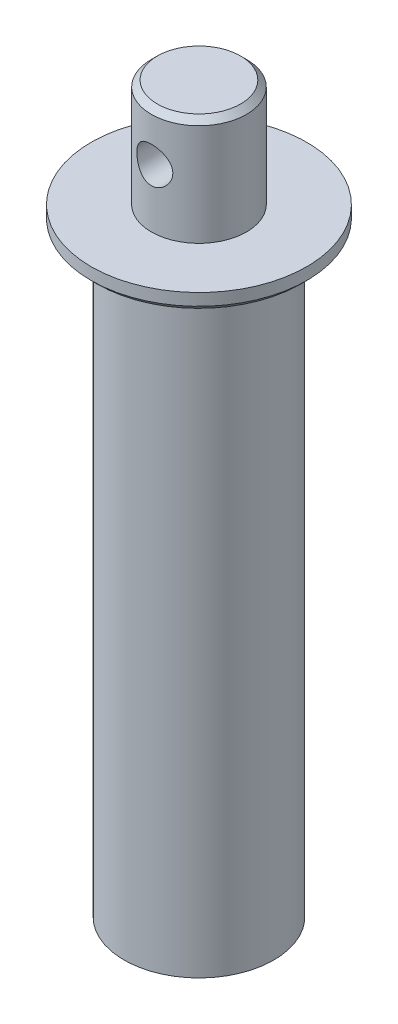
ISO-10303-21;
HEADER;
FILE_DESCRIPTION(('STEP AP214'),'2;1');
FILE_NAME('part.step','',(''),(''),'','','');
FILE_SCHEMA(('AUTOMOTIVE_DESIGN { 1 0 10303 214 1 1 1 1 }'));
ENDSEC;
DATA;
#1=APPLICATION_CONTEXT('core data for automotive mechanical design processes');
#2=APPLICATION_PROTOCOL_DEFINITION('international standard','automotive_design',2000,#1);
#3=PRODUCT_CONTEXT('',#1,'mechanical');
#4=PRODUCT('Part','Part','',(#3));
#5=PRODUCT_RELATED_PRODUCT_CATEGORY('part','',(#4));
#6=PRODUCT_DEFINITION_FORMATION('','',#4);
#7=PRODUCT_DEFINITION_CONTEXT('part definition',#1,'design');
#8=PRODUCT_DEFINITION('design','',#6,#7);
#9=PRODUCT_DEFINITION_SHAPE('','',#8);
#10=(LENGTH_UNIT() NAMED_UNIT(*) SI_UNIT(.MILLI.,.METRE.));
#11=(NAMED_UNIT(*) PLANE_ANGLE_UNIT() SI_UNIT($,.RADIAN.));
#12=(NAMED_UNIT(*) SI_UNIT($,.STERADIAN.) SOLID_ANGLE_UNIT());
#13=UNCERTAINTY_MEASURE_WITH_UNIT(LENGTH_MEASURE(1.E-05),#10,'distance_accuracy_value','');
#14=(GEOMETRIC_REPRESENTATION_CONTEXT(3) GLOBAL_UNCERTAINTY_ASSIGNED_CONTEXT((#13)) GLOBAL_UNIT_ASSIGNED_CONTEXT((#10,
#11,#12)) REPRESENTATION_CONTEXT('',''));
#15=CARTESIAN_POINT('',(0.,0.,0.));
#16=DIRECTION('',(0.,0.,1.));
#17=DIRECTION('',(1.,0.,0.));
#18=AXIS2_PLACEMENT_3D('',#15,#16,#17);
#19=CARTESIAN_POINT('',(0.,18.,0.));
#20=DIRECTION('',(0.,-1.,0.));
#21=DIRECTION('',(0.,0.,-1.));
#22=AXIS2_PLACEMENT_3D('',#19,#20,#21);
#23=CYLINDRICAL_SURFACE('',#22,7.95);
#24=CARTESIAN_POINT('',(0.,12.7,-7.95));
#25=CARTESIAN_POINT('',(-0.162397491346748,12.7000061558222,-7.95000463305476));
#26=CARTESIAN_POINT('',(-0.324753099848184,12.686772434708,-7.94498084128038));
#27=CARTESIAN_POINT('',(-0.644608276496746,12.6344046885734,-7.92544254710234));
#28=CARTESIAN_POINT('',(-0.802108607238702,12.5952747528614,-7.91092954315817));
#29=CARTESIAN_POINT('',(-1.10759384707584,12.4926982224202,-7.87396945860854));
#30=CARTESIAN_POINT('',(-1.25559660387506,12.4292988958457,-7.85153780728387));
#31=CARTESIAN_POINT('',(-1.53885384506537,12.2802252539554,-7.80097147100144));
#32=CARTESIAN_POINT('',(-1.67410485143574,12.1945448853293,-7.77283523668182));
#33=CARTESIAN_POINT('',(-1.93382546780257,11.9995011008524,-7.71241146666441));
#34=CARTESIAN_POINT('',(-2.05767538384719,11.8893495621118,-7.68000542519286));
#35=CARTESIAN_POINT('',(-2.28564512635348,11.6501633262448,-7.61527381268037));
#36=CARTESIAN_POINT('',(-2.38975880250598,11.5211227649516,-7.58294826981162));
#37=CARTESIAN_POINT('',(-2.57926636225751,11.2417374560993,-7.52065411531348));
#38=CARTESIAN_POINT('',(-2.6637805831916,11.0907618050901,-7.49082499932832));
#39=CARTESIAN_POINT('',(-2.80594178602416,10.7754371382371,-7.43874757327125));
#40=CARTESIAN_POINT('',(-2.86359965340992,10.611093572494,-7.41649619275682));
#41=CARTESIAN_POINT('',(-2.94795796885627,10.2808348690774,-7.38336190811873));
#42=CARTESIAN_POINT('',(-2.97584212262488,10.115266990026,-7.37204616258461));
#43=CARTESIAN_POINT('',(-3.00356228598173,9.7814451398545,-7.36079887492185));
#44=CARTESIAN_POINT('',(-3.00341006762254,9.61319232577162,-7.36086255474267));
#45=CARTESIAN_POINT('',(-2.97596618835097,9.28965599589298,-7.37199408836324));
#46=CARTESIAN_POINT('',(-2.950323119074,9.13420535263497,-7.38239348387374));
#47=CARTESIAN_POINT('',(-2.87535300460385,8.83000298266155,-7.41191277552078));
#48=CARTESIAN_POINT('',(-2.8260223465669,8.68125228161165,-7.43103400189338));
#49=CARTESIAN_POINT('',(-2.70418189216197,8.39133492929746,-7.47624078591974));
#50=CARTESIAN_POINT('',(-2.6312480533409,8.2503669739539,-7.50245218680417));
#51=CARTESIAN_POINT('',(-2.46456734066459,7.98219471048518,-7.55884475137268));
#52=CARTESIAN_POINT('',(-2.3708132173386,7.8549952194409,-7.58902729628462));
#53=CARTESIAN_POINT('',(-2.15763402761747,7.60885443691731,-7.65246921492573));
#54=CARTESIAN_POINT('',(-2.03689525756286,7.49106604037545,-7.68579812115875));
#55=CARTESIAN_POINT('',(-1.77699753283556,7.27706373431274,-7.75001160096118));
#56=CARTESIAN_POINT('',(-1.63783568074396,7.18085322479597,-7.78089578882361));
#57=CARTESIAN_POINT('',(-1.34207116187379,7.01144460931163,-7.8373678710877));
#58=CARTESIAN_POINT('',(-1.18522721144044,6.93863503487575,-7.86286415320891));
#59=CARTESIAN_POINT('',(-0.86031470200094,6.82081904211372,-7.90500692503182));
#60=CARTESIAN_POINT('',(-0.692251231753698,6.77580011265377,-7.92165739657785));
#61=CARTESIAN_POINT('',(-0.359369733398546,6.71707032438193,-7.94353018166807));
#62=CARTESIAN_POINT('',(-0.19486250407749,6.70180726332692,-7.94931845634064));
#63=CARTESIAN_POINT('',(0.134445660228267,6.69849692676496,-7.95056675753456));
#64=CARTESIAN_POINT('',(0.299246520773491,6.71044352644258,-7.94602910839152));
#65=CARTESIAN_POINT('',(0.617726140759181,6.76003703811891,-7.92750856979343));
#66=CARTESIAN_POINT('',(0.771587980773982,6.79666317138276,-7.91390105530444));
#67=CARTESIAN_POINT('',(1.07087124221814,6.89322789669408,-7.87898797802321));
#68=CARTESIAN_POINT('',(1.21629156356081,6.95316951937971,-7.85768141450416));
#69=CARTESIAN_POINT('',(1.49937620417867,7.09658093164373,-7.8086891601555));
#70=CARTESIAN_POINT('',(1.63668485220481,7.18069302598826,-7.78083372768987));
#71=CARTESIAN_POINT('',(1.89570132393103,7.36933296202654,-7.7218192041405));
#72=CARTESIAN_POINT('',(2.01740330922294,7.47386840734707,-7.6906588846264));
#73=CARTESIAN_POINT('',(2.24923419609776,7.70761385915857,-7.62618977395529));
#74=CARTESIAN_POINT('',(2.35826281750802,7.83791282891418,-7.59286232939511));
#75=CARTESIAN_POINT('',(2.55312943709526,8.1156069199928,-7.52957881379437));
#76=CARTESIAN_POINT('',(2.63896520992051,8.26300367990923,-7.49962306642862));
#77=CARTESIAN_POINT('',(2.78513438407435,8.57201209893149,-7.44658528316189));
#78=CARTESIAN_POINT('',(2.84534845350868,8.733686127761,-7.42353555585956));
#79=CARTESIAN_POINT('',(2.93729581964043,9.06599351023611,-7.38764350420071));
#80=CARTESIAN_POINT('',(2.96904704082561,9.23662115356447,-7.374794756358));
#81=CARTESIAN_POINT('',(3.00155503802499,9.57005302179686,-7.36161978142478));
#82=CARTESIAN_POINT('',(3.00419110375903,9.73264550820018,-7.36053436127972));
#83=CARTESIAN_POINT('',(2.98321973734044,10.0558276842463,-7.36905868877781));
#84=CARTESIAN_POINT('',(2.95961485946022,10.2164175672823,-7.37866739546335));
#85=CARTESIAN_POINT('',(2.88830176573362,10.5259293606051,-7.40686184253781));
#86=CARTESIAN_POINT('',(2.84137107510192,10.6750591479437,-7.42515720122094));
#87=CARTESIAN_POINT('',(2.72542723369112,10.963412785519,-7.46849099490141));
#88=CARTESIAN_POINT('',(2.65640846747208,11.1026341057172,-7.49353114436682));
#89=CARTESIAN_POINT('',(2.4940127469099,11.375226883347,-7.54918066261999));
#90=CARTESIAN_POINT('',(2.39954048534419,11.5078994030905,-7.58001455370614));
#91=CARTESIAN_POINT('',(2.19060617827199,11.7561080525092,-7.64301253026733));
#92=CARTESIAN_POINT('',(2.07613773887328,11.8716386790474,-7.67517703869663));
#93=CARTESIAN_POINT('',(1.82292686694646,12.0887750295145,-7.73934015838431));
#94=CARTESIAN_POINT('',(1.68319475235042,12.1892633965218,-7.7712320684291));
#95=CARTESIAN_POINT('',(1.38770505428977,12.365304905216,-7.82939530273651));
#96=CARTESIAN_POINT('',(1.23194587961074,12.4408555678737,-7.85566606811619));
#97=CARTESIAN_POINT('',(0.900729443719499,12.5673316594021,-7.90065816243918));
#98=CARTESIAN_POINT('',(0.72468257870646,12.6168806341044,-7.91895015266806));
#99=CARTESIAN_POINT('',(0.36573704474032,12.6832028472176,-7.94361537532247));
#100=CARTESIAN_POINT('',(0.182841976353428,12.6999930692113,-7.94999478368242));
#101=CARTESIAN_POINT('',(0.,12.7,-7.95));
#102=B_SPLINE_CURVE_WITH_KNOTS('',3,(#24,#25,#26,#27,#28,#29,#30,#31,#32,#33,#34,#35,#36,#37,
#38,#39,#40,#41,#42,#43,#44,#45,#46,#47,#48,#49,#50,#51,#52,#53,#54,#55,#56,#57,#58,#59,#60,#61,
#62,#63,#64,#65,#66,#67,#68,#69,#70,#71,#72,#73,#74,#75,#76,#77,#78,#79,#80,#81,#82,#83,#84,#85,
#86,#87,#88,#89,#90,#91,#92,#93,#94,#95,#96,#97,#98,#99,#100,#101),.UNSPECIFIED.,.T.,.F.,(4,2,2,
2,2,2,2,2,2,2,2,2,2,2,2,2,2,2,2,2,2,2,2,2,2,2,2,2,2,2,2,2,2,2,2,2,2,2,4),(0.,0.486517984474757,
0.972959160520783,1.45845770295972,1.94408828362444,2.44851024997547,2.95308914942897,
3.47718162143792,4.00106148167018,4.50323487057201,5.00519740487303,5.47667849204093,
5.94823151260985,6.42877607760176,6.90948822777715,7.42294833461538,7.93648929004924,
8.45816227693261,8.97960023906363,9.4730216283662,9.96633196092749,10.4403977118492,
10.9145251042877,11.4026484582173,11.8909538882842,12.4079529144854,12.9250015290952,
13.4444325927827,13.9635363143255,14.4489214843418,14.9342594114916,15.4044069203738,
15.8746740496895,16.36981560475,16.8651157749309,17.3876947690209,17.9103256964684,
18.4583764326353,19.0061429595389),.UNSPECIFIED.);
#103=CARTESIAN_POINT('',(0.,12.7,-7.95));
#104=VERTEX_POINT('',#103);
#105=EDGE_CURVE('E38',#104,#104,#102,.T.);
#106=ORIENTED_EDGE('',*,*,#105,.T.);
#107=EDGE_LOOP('',(#106));
#108=FACE_BOUND('',#107,.T.);
#109=CARTESIAN_POINT('',(3.,9.7,7.36223471508482));
#110=CARTESIAN_POINT('',(2.99998847638603,9.53818087912798,7.36224526269351));
#111=CARTESIAN_POINT('',(2.9868408533845,9.3762103722872,7.36763957602915));
#112=CARTESIAN_POINT('',(2.93479898105657,9.05725888996367,7.38851783959744));
#113=CARTESIAN_POINT('',(2.89590575612689,8.90027771621983,7.40400138838714));
#114=CARTESIAN_POINT('',(2.79402781177854,8.59586930724842,7.44304061076884));
#115=CARTESIAN_POINT('',(2.731101471071,8.44841992534473,7.46657670963436));
#116=CARTESIAN_POINT('',(2.58314510981222,8.16612081406447,7.51904250584225));
#117=CARTESIAN_POINT('',(2.49810836153358,8.03127493667398,7.54797384408236));
#118=CARTESIAN_POINT('',(2.30376153242717,7.77121232087998,7.60960064181843));
#119=CARTESIAN_POINT('',(2.19351841745457,7.64671904452181,7.64240778971228));
#120=CARTESIAN_POINT('',(1.95386685111475,7.41747705800545,7.70715883050975));
#121=CARTESIAN_POINT('',(1.82445425584252,7.31273262815022,7.73910253499114));
#122=CARTESIAN_POINT('',(1.5446329927432,7.12246295020474,7.79985728918744));
#123=CARTESIAN_POINT('',(1.3936537720354,7.03772592201908,7.82852214322748));
#124=CARTESIAN_POINT('',(1.07830992462711,6.89515458942065,7.87814508841391));
#125=CARTESIAN_POINT('',(0.913950027301735,6.83731082772747,7.89910588822244));
#126=CARTESIAN_POINT('',(0.584118525776006,6.75271083408455,7.93016590252776));
#127=CARTESIAN_POINT('',(0.419008191449069,6.72470854121812,7.9406990457691));
#128=CARTESIAN_POINT('',(0.0861182550130894,6.69659199426228,7.9512752587645));
#129=CARTESIAN_POINT('',(-0.0816604499755095,6.69646855740847,7.95132178261133));
#130=CARTESIAN_POINT('',(-0.406186165059413,6.7233915100908,7.94119442034515));
#131=CARTESIAN_POINT('',(-0.563064807507878,6.74907733331319,7.93153233504782));
#132=CARTESIAN_POINT('',(-0.870095460195534,6.82459864135385,7.90374636952053));
#133=CARTESIAN_POINT('',(-1.02024699260719,6.87443583868587,7.88562188924655));
#134=CARTESIAN_POINT('',(-1.31216781002694,6.9974680388243,7.84237373573117));
#135=CARTESIAN_POINT('',(-1.45378254871369,7.07099371538483,7.81715165701678));
#136=CARTESIAN_POINT('',(-1.72301698371786,7.23902153583117,7.76225605799518));
#137=CARTESIAN_POINT('',(-1.85063211474019,7.33353049219717,7.73258109302015));
#138=CARTESIAN_POINT('',(-2.09625291168491,7.54737826155229,7.66976135047149));
#139=CARTESIAN_POINT('',(-2.2132430127343,7.66785547278632,7.63651515908535));
#140=CARTESIAN_POINT('',(-2.42574456827632,7.92691204717986,7.57169953695764));
#141=CARTESIAN_POINT('',(-2.52125048739725,8.06549606102768,7.54013053993966));
#142=CARTESIAN_POINT('',(-2.69004722792075,8.36088829744311,7.48159976832992));
#143=CARTESIAN_POINT('',(-2.76278393320141,8.51803907720284,7.45475898596922));
#144=CARTESIAN_POINT('',(-2.880375100483,8.84363902404656,7.41012433225883));
#145=CARTESIAN_POINT('',(-2.92524531348823,9.0120817488069,7.39232535124068));
#146=CARTESIAN_POINT('',(-2.98350497294114,9.34543862821912,7.36899818161272));
#147=CARTESIAN_POINT('',(-2.99850974291805,9.51002612552786,7.36284132147711));
#148=CARTESIAN_POINT('',(-3.00127750176349,9.83944639008965,7.36171480133552));
#149=CARTESIAN_POINT('',(-2.98904742268387,10.0042790842612,7.36674229458981));
#150=CARTESIAN_POINT('',(-2.93915784101862,10.3211629550074,7.38677890427645));
#151=CARTESIAN_POINT('',(-2.90275536170076,10.4734469127311,7.40129408111521));
#152=CARTESIAN_POINT('',(-2.80714040331809,10.7696728223296,7.43808226609779));
#153=CARTESIAN_POINT('',(-2.74792321527995,10.9136130449902,7.46035687570344));
#154=CARTESIAN_POINT('',(-2.60584361626127,11.1951164240263,7.51118902933162));
#155=CARTESIAN_POINT('',(-2.5221722334124,11.3322330449096,7.53995219207521));
#156=CARTESIAN_POINT('',(-2.33441687648243,11.5910526702668,7.60017799915619));
#157=CARTESIAN_POINT('',(-2.2303253503514,11.7127499446626,7.63164163979143));
#158=CARTESIAN_POINT('',(-1.99676156560833,11.9453999274485,7.69616935064396));
#159=CARTESIAN_POINT('',(-1.86608723424952,12.055157597863,7.72920614910852));
#160=CARTESIAN_POINT('',(-1.5873664361605,12.2513337907439,7.79122096312534));
#161=CARTESIAN_POINT('',(-1.43931986006059,12.3377521662627,7.82019895312222));
#162=CARTESIAN_POINT('',(-1.13009967886562,12.4842477994431,7.87082025135715));
#163=CARTESIAN_POINT('',(-0.968969651016516,12.5444085640794,7.89248676165433));
#164=CARTESIAN_POINT('',(-0.637870931627841,12.6364273074365,7.9261118932038));
#165=CARTESIAN_POINT('',(-0.467906493780563,12.6682987760011,7.9380751412537));
#166=CARTESIAN_POINT('',(-0.134758318572021,12.7013659427001,7.95050234819133));
#167=CARTESIAN_POINT('',(0.0282347182748412,12.7042587720064,7.95160244842512));
#168=CARTESIAN_POINT('',(0.352286714056232,12.6836626905325,7.94384354853882));
#169=CARTESIAN_POINT('',(0.513345908784079,12.6601770297837,7.93498577530464));
#170=CARTESIAN_POINT('',(0.824872903926982,12.5886848977638,7.90859918182994));
#171=CARTESIAN_POINT('',(0.975504704927181,12.5413048913794,7.89129223621013));
#172=CARTESIAN_POINT('',(1.26668938334082,12.4239952510697,7.84981845145297));
#173=CARTESIAN_POINT('',(1.407240345928,12.3540613468895,7.82565031335174));
#174=CARTESIAN_POINT('',(1.68078304743255,12.1902710199168,7.77159770902848));
#175=CARTESIAN_POINT('',(1.81320405662409,12.0955282806332,7.74151478259925));
#176=CARTESIAN_POINT('',(2.06079145832988,11.886191784806,7.67932043381079));
#177=CARTESIAN_POINT('',(2.17595163342778,11.7715909071818,7.64720828641126));
#178=CARTESIAN_POINT('',(2.39209703979936,11.5185257698201,7.58246561904029));
#179=CARTESIAN_POINT('',(2.49199147751535,11.3791116040763,7.54989958951667));
#180=CARTESIAN_POINT('',(2.66701047282742,11.0843339824656,7.48987098387787));
#181=CARTESIAN_POINT('',(2.74213185351583,10.9289684843405,7.46240906251267));
#182=CARTESIAN_POINT('',(2.83572851156726,10.6832960070156,7.427133469645));
#183=CARTESIAN_POINT('',(2.86416654860317,10.5971118170317,7.41618073356408));
#184=CARTESIAN_POINT('',(2.91317517775546,10.4222468796589,7.39706747795765));
#185=CARTESIAN_POINT('',(2.93374932570495,10.3335672801464,7.38890569661591));
#186=CARTESIAN_POINT('',(2.96676758310502,10.1545045054933,7.37571079709818));
#187=CARTESIAN_POINT('',(2.97921437058769,10.0641219016166,7.37067664836809));
#188=CARTESIAN_POINT('',(2.99583331277785,9.88250884982683,7.36393584017285));
#189=CARTESIAN_POINT('',(3.00000650021022,9.79127850915807,7.36222876541712));
#190=CARTESIAN_POINT('',(3.,9.7,7.36223471508482));
#191=B_SPLINE_CURVE_WITH_KNOTS('',3,(#109,#110,#111,#112,#113,#114,#115,#116,#117,#118,#119,
#120,#121,#122,#123,#124,#125,#126,#127,#128,#129,#130,#131,#132,#133,#134,#135,#136,#137,#138,
#139,#140,#141,#142,#143,#144,#145,#146,#147,#148,#149,#150,#151,#152,#153,#154,#155,#156,#157,
#158,#159,#160,#161,#162,#163,#164,#165,#166,#167,#168,#169,#170,#171,#172,#173,#174,#175,#176,
#177,#178,#179,#180,#181,#182,#183,#184,#185,#186,#187,#188,#189,#190),.UNSPECIFIED.,.T.,.F.,(4,
2,2,2,2,2,2,2,2,2,2,2,2,2,2,2,2,2,2,2,2,2,2,2,2,2,2,2,2,2,2,2,2,2,2,2,2,2,2,2,4),(0.,
0.485113019094003,0.97020673709227,1.45412953481374,1.93819975263346,2.44443134249792,
2.95077252559746,3.47459178516768,3.99822669897873,4.49901899995725,4.99964634924538,
5.47519839146572,5.95078415883133,6.43331940839045,6.91601154864105,7.42726811632732,
7.93865625811923,8.46166485432304,8.98437756017793,9.47795435847515,9.97140554165079,
10.4410183842214,10.9107282072142,11.3981880218201,11.885828456347,12.4048427572537,
12.9238603258718,13.4412150191416,13.9583228773832,14.444955850278,14.9315288728514,
15.4059609368032,15.8804828804031,16.3750646117023,16.8698240672408,17.3911057262614,
17.9124542086976,18.1863439084664,18.4601096159644,18.7337850698281,19.0074263609033),.UNSPECIFIED.);
#192=CARTESIAN_POINT('',(3.,9.7,7.36223471508482));
#193=VERTEX_POINT('',#192);
#194=EDGE_CURVE('E71',#193,#193,#191,.T.);
#195=ORIENTED_EDGE('',*,*,#194,.T.);
#196=EDGE_LOOP('',(#195));
#197=FACE_BOUND('',#196,.T.);
#198=CARTESIAN_POINT('',(0.,17.,0.));
#199=DIRECTION('',(0.,1.,0.));
#200=DIRECTION('',(0.,0.,1.));
#201=AXIS2_PLACEMENT_3D('',#198,#199,#200);
#202=CIRCLE('',#201,7.95);
#203=CARTESIAN_POINT('',(0.,17.,7.95));
#204=VERTEX_POINT('',#203);
#205=EDGE_CURVE('E67',#204,#204,#202,.F.);
#206=ORIENTED_EDGE('',*,*,#205,.T.);
#207=EDGE_LOOP('',(#206));
#208=FACE_BOUND('',#207,.T.);
#209=CARTESIAN_POINT('',(0.,0.,0.));
#210=DIRECTION('',(0.,1.,0.));
#211=DIRECTION('',(0.,0.,1.));
#212=AXIS2_PLACEMENT_3D('',#209,#210,#211);
#213=CIRCLE('',#212,7.95);
#214=CARTESIAN_POINT('',(0.,0.,7.95));
#215=VERTEX_POINT('',#214);
#216=EDGE_CURVE('E61',#215,#215,#213,.T.);
#217=ORIENTED_EDGE('',*,*,#216,.T.);
#218=EDGE_LOOP('',(#217));
#219=FACE_BOUND('',#218,.T.);
#220=ADVANCED_FACE('F33',(#108,#197,#208,#219),#23,.T.);
#221=CARTESIAN_POINT('',(0.,18.,0.));
#222=DIRECTION('',(0.,1.,0.));
#223=DIRECTION('',(0.,0.,1.));
#224=AXIS2_PLACEMENT_3D('',#221,#222,#223);
#225=PLANE('',#224);
#226=CARTESIAN_POINT('',(0.,18.,0.));
#227=DIRECTION('',(0.,1.,0.));
#228=DIRECTION('',(0.,0.,1.));
#229=AXIS2_PLACEMENT_3D('',#226,#227,#228);
#230=CIRCLE('',#229,6.95);
#231=CARTESIAN_POINT('',(0.,18.,6.95));
#232=VERTEX_POINT('',#231);
#233=EDGE_CURVE('E64',#232,#232,#230,.T.);
#234=ORIENTED_EDGE('',*,*,#233,.T.);
#235=EDGE_LOOP('',(#234));
#236=FACE_BOUND('',#235,.T.);
#237=ADVANCED_FACE('F108',(#236),#225,.T.);
#238=CARTESIAN_POINT('',(0.,18.,0.));
#239=DIRECTION('',(0.,-1.,0.));
#240=DIRECTION('',(0.,0.,-1.));
#241=AXIS2_PLACEMENT_3D('',#238,#239,#240);
#242=CONICAL_SURFACE('',#241,6.95,0.785398163397444);
#243=ORIENTED_EDGE('',*,*,#205,.F.);
#244=EDGE_LOOP('',(#243));
#245=FACE_BOUND('',#244,.T.);
#246=ORIENTED_EDGE('',*,*,#233,.F.);
#247=EDGE_LOOP('',(#246));
#248=FACE_BOUND('',#247,.T.);
#249=ADVANCED_FACE('F106',(#245,#248),#242,.T.);
#250=CARTESIAN_POINT('',(0.,-3.,0.));
#251=DIRECTION('',(0.,1.,0.));
#252=DIRECTION('',(0.,0.,1.));
#253=AXIS2_PLACEMENT_3D('',#250,#251,#252);
#254=CYLINDRICAL_SURFACE('',#253,18.);
#255=CARTESIAN_POINT('',(0.,-2.,0.));
#256=DIRECTION('',(0.,1.,0.));
#257=DIRECTION('',(0.,0.,1.));
#258=AXIS2_PLACEMENT_3D('',#255,#256,#257);
#259=CIRCLE('',#258,18.);
#260=CARTESIAN_POINT('',(0.,-2.,18.));
#261=VERTEX_POINT('',#260);
#262=EDGE_CURVE('E52',#261,#261,#259,.T.);
#263=ORIENTED_EDGE('',*,*,#262,.T.);
#264=EDGE_LOOP('',(#263));
#265=FACE_BOUND('',#264,.T.);
#266=CARTESIAN_POINT('',(0.,0.,0.));
#267=DIRECTION('',(0.,1.,0.));
#268=DIRECTION('',(0.,0.,1.));
#269=AXIS2_PLACEMENT_3D('',#266,#267,#268);
#270=CIRCLE('',#269,18.);
#271=CARTESIAN_POINT('',(0.,0.,18.));
#272=VERTEX_POINT('',#271);
#273=EDGE_CURVE('E58',#272,#272,#270,.T.);
#274=ORIENTED_EDGE('',*,*,#273,.F.);
#275=EDGE_LOOP('',(#274));
#276=FACE_BOUND('',#275,.T.);
#277=ADVANCED_FACE('F100',(#265,#276),#254,.T.);
#278=CARTESIAN_POINT('',(0.,-3.,0.));
#279=DIRECTION('',(0.,1.,0.));
#280=DIRECTION('',(0.,0.,1.));
#281=AXIS2_PLACEMENT_3D('',#278,#279,#280);
#282=PLANE('',#281);
#283=CARTESIAN_POINT('',(0.,-3.,0.));
#284=DIRECTION('',(0.,-1.,0.));
#285=DIRECTION('',(0.,0.,-1.));
#286=AXIS2_PLACEMENT_3D('',#283,#284,#285);
#287=CIRCLE('',#286,12.5);
#288=CARTESIAN_POINT('',(0.,-3.,-12.5));
#289=VERTEX_POINT('',#288);
#290=EDGE_CURVE('E10',#289,#289,#287,.T.);
#291=ORIENTED_EDGE('',*,*,#290,.F.);
#292=EDGE_LOOP('',(#291));
#293=FACE_BOUND('',#292,.T.);
#294=CARTESIAN_POINT('',(0.,-3.,0.));
#295=DIRECTION('',(0.,1.,0.));
#296=DIRECTION('',(0.,0.,1.));
#297=AXIS2_PLACEMENT_3D('',#294,#295,#296);
#298=CIRCLE('',#297,17.);
#299=CARTESIAN_POINT('',(0.,-3.,17.));
#300=VERTEX_POINT('',#299);
#301=EDGE_CURVE('E47',#300,#300,#298,.F.);
#302=ORIENTED_EDGE('',*,*,#301,.T.);
#303=EDGE_LOOP('',(#302));
#304=FACE_BOUND('',#303,.T.);
#305=ADVANCED_FACE('F96',(#293,#304),#282,.F.);
#306=CARTESIAN_POINT('',(0.,0.,0.));
#307=DIRECTION('',(0.,1.,0.));
#308=DIRECTION('',(0.,0.,1.));
#309=AXIS2_PLACEMENT_3D('',#306,#307,#308);
#310=PLANE('',#309);
#311=ORIENTED_EDGE('',*,*,#216,.F.);
#312=EDGE_LOOP('',(#311));
#313=FACE_BOUND('',#312,.T.);
#314=ORIENTED_EDGE('',*,*,#273,.T.);
#315=EDGE_LOOP('',(#314));
#316=FACE_BOUND('',#315,.T.);
#317=ADVANCED_FACE('F99',(#313,#316),#310,.T.);
#318=CARTESIAN_POINT('',(0.,-2.,0.));
#319=DIRECTION('',(0.,1.,0.));
#320=DIRECTION('',(0.,0.,1.));
#321=AXIS2_PLACEMENT_3D('',#318,#319,#320);
#322=CONICAL_SURFACE('',#321,18.,0.78539816339745);
#323=ORIENTED_EDGE('',*,*,#301,.F.);
#324=EDGE_LOOP('',(#323));
#325=FACE_BOUND('',#324,.T.);
#326=ORIENTED_EDGE('',*,*,#262,.F.);
#327=EDGE_LOOP('',(#326));
#328=FACE_BOUND('',#327,.T.);
#329=ADVANCED_FACE('F36',(#325,#328),#322,.T.);
#330=CARTESIAN_POINT('',(0.,-103.,0.));
#331=DIRECTION('',(0.,1.,0.));
#332=DIRECTION('',(0.,0.,1.));
#333=AXIS2_PLACEMENT_3D('',#330,#331,#332);
#334=CYLINDRICAL_SURFACE('',#333,12.5);
#335=CARTESIAN_POINT('',(0.,-103.,0.));
#336=DIRECTION('',(0.,-1.,0.));
#337=DIRECTION('',(0.,0.,-1.));
#338=AXIS2_PLACEMENT_3D('',#335,#336,#337);
#339=CIRCLE('',#338,12.5);
#340=CARTESIAN_POINT('',(0.,-103.,-12.5));
#341=VERTEX_POINT('',#340);
#342=EDGE_CURVE('E56',#341,#341,#339,.T.);
#343=ORIENTED_EDGE('',*,*,#342,.F.);
#344=EDGE_LOOP('',(#343));
#345=FACE_BOUND('',#344,.T.);
#346=ORIENTED_EDGE('',*,*,#290,.T.);
#347=EDGE_LOOP('',(#346));
#348=FACE_BOUND('',#347,.T.);
#349=ADVANCED_FACE('F91',(#345,#348),#334,.T.);
#350=CARTESIAN_POINT('',(0.,-103.,0.));
#351=DIRECTION('',(0.,-1.,0.));
#352=DIRECTION('',(0.,0.,-1.));
#353=AXIS2_PLACEMENT_3D('',#350,#351,#352);
#354=PLANE('',#353);
#355=CARTESIAN_POINT('',(0.,-103.,0.));
#356=DIRECTION('',(0.,-1.,0.));
#357=DIRECTION('',(0.,0.,-1.));
#358=AXIS2_PLACEMENT_3D('',#355,#356,#357);
#359=CIRCLE('',#358,7.95);
#360=CARTESIAN_POINT('',(0.,-103.,-7.95));
#361=VERTEX_POINT('',#360);
#362=EDGE_CURVE('E76',#361,#361,#359,.T.);
#363=ORIENTED_EDGE('',*,*,#362,.F.);
#364=EDGE_LOOP('',(#363));
#365=FACE_BOUND('',#364,.T.);
#366=ORIENTED_EDGE('',*,*,#342,.T.);
#367=EDGE_LOOP('',(#366));
#368=FACE_BOUND('',#367,.T.);
#369=ADVANCED_FACE('F85',(#365,#368),#354,.T.);
#370=CARTESIAN_POINT('',(0.,9.7,-18.));
#371=DIRECTION('',(0.,0.,1.));
#372=DIRECTION('',(1.,0.,0.));
#373=AXIS2_PLACEMENT_3D('',#370,#371,#372);
#374=CYLINDRICAL_SURFACE('',#373,3.);
#375=ORIENTED_EDGE('',*,*,#194,.F.);
#376=EDGE_LOOP('',(#375));
#377=FACE_BOUND('',#376,.T.);
#378=ORIENTED_EDGE('',*,*,#105,.F.);
#379=EDGE_LOOP('',(#378));
#380=FACE_BOUND('',#379,.T.);
#381=ADVANCED_FACE('F79',(#377,#380),#374,.F.);
#382=CARTESIAN_POINT('',(0.,-125.485995641732,0.));
#383=DIRECTION('',(0.,1.,0.));
#384=DIRECTION('',(0.,0.,1.));
#385=AXIS2_PLACEMENT_3D('',#382,#383,#384);
#386=CYLINDRICAL_SURFACE('',#385,7.95);
#387=CARTESIAN_POINT('',(0.,-13.,0.));
#388=DIRECTION('',(0.,-1.,0.));
#389=DIRECTION('',(0.,0.,-1.));
#390=AXIS2_PLACEMENT_3D('',#387,#388,#389);
#391=CIRCLE('',#390,7.95);
#392=CARTESIAN_POINT('',(0.,-13.,-7.95));
#393=VERTEX_POINT('',#392);
#394=EDGE_CURVE('E176',#393,#393,#391,.T.);
#395=ORIENTED_EDGE('',*,*,#394,.F.);
#396=EDGE_LOOP('',(#395));
#397=FACE_BOUND('',#396,.T.);
#398=ORIENTED_EDGE('',*,*,#362,.T.);
#399=EDGE_LOOP('',(#398));
#400=FACE_BOUND('',#399,.T.);
#401=ADVANCED_FACE('F84',(#397,#400),#386,.F.);
#402=CARTESIAN_POINT('',(0.,-13.,0.));
#403=DIRECTION('',(0.,-1.,0.));
#404=DIRECTION('',(0.,0.,-1.));
#405=AXIS2_PLACEMENT_3D('',#402,#403,#404);
#406=PLANE('',#405);
#407=ORIENTED_EDGE('',*,*,#394,.T.);
#408=EDGE_LOOP('',(#407));
#409=FACE_BOUND('',#408,.T.);
#410=ADVANCED_FACE('F162',(#409),#406,.T.);
#411=CLOSED_SHELL('',(#220,#237,#249,#277,#305,#317,#329,#349,#369,#381,#401,#410));
#412=MANIFOLD_SOLID_BREP('B2',#411);
#413=ADVANCED_BREP_SHAPE_REPRESENTATION('',(#18,#412),#14);
#414=SHAPE_DEFINITION_REPRESENTATION(#9,#413);
ENDSEC;
END-ISO-10303-21;
